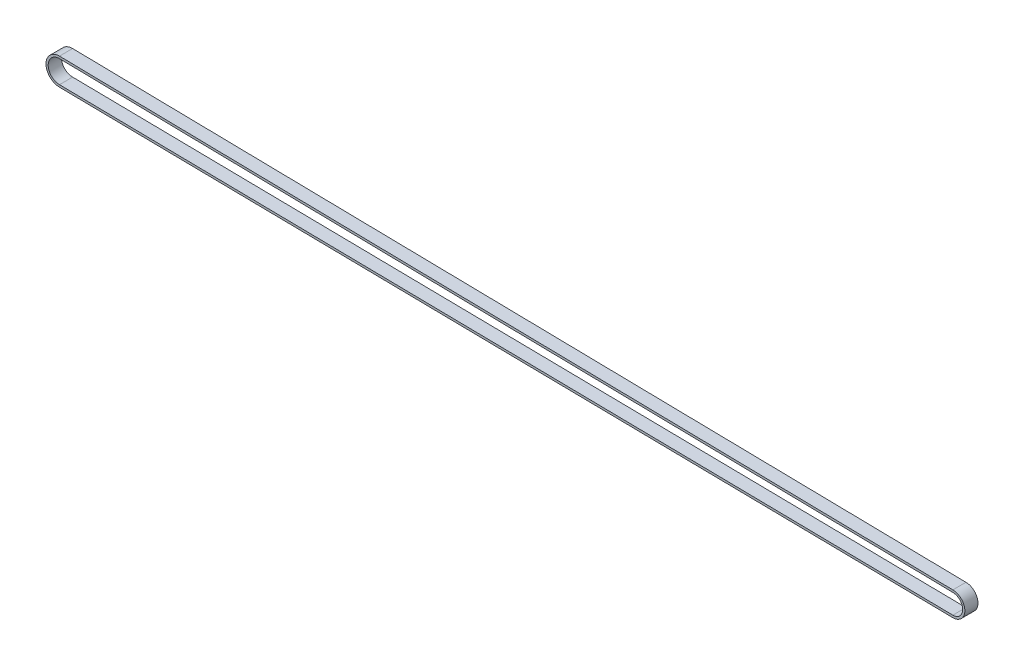
ISO-10303-21;
HEADER;
FILE_DESCRIPTION(('STEP AP214'),'2;1');
FILE_NAME('part.step','',(''),(''),'','','');
FILE_SCHEMA(('AUTOMOTIVE_DESIGN { 1 0 10303 214 1 1 1 1 }'));
ENDSEC;
DATA;
#1=APPLICATION_CONTEXT('core data for automotive mechanical design processes');
#2=APPLICATION_PROTOCOL_DEFINITION('international standard','automotive_design',2000,#1);
#3=PRODUCT_CONTEXT('',#1,'mechanical');
#4=PRODUCT('Part','Part','',(#3));
#5=PRODUCT_RELATED_PRODUCT_CATEGORY('part','',(#4));
#6=PRODUCT_DEFINITION_FORMATION('','',#4);
#7=PRODUCT_DEFINITION_CONTEXT('part definition',#1,'design');
#8=PRODUCT_DEFINITION('design','',#6,#7);
#9=PRODUCT_DEFINITION_SHAPE('','',#8);
#10=(LENGTH_UNIT() NAMED_UNIT(*) SI_UNIT(.MILLI.,.METRE.));
#11=(NAMED_UNIT(*) PLANE_ANGLE_UNIT() SI_UNIT($,.RADIAN.));
#12=(NAMED_UNIT(*) SI_UNIT($,.STERADIAN.) SOLID_ANGLE_UNIT());
#13=UNCERTAINTY_MEASURE_WITH_UNIT(LENGTH_MEASURE(1.E-05),#10,'distance_accuracy_value','');
#14=(GEOMETRIC_REPRESENTATION_CONTEXT(3) GLOBAL_UNCERTAINTY_ASSIGNED_CONTEXT((#13)) GLOBAL_UNIT_ASSIGNED_CONTEXT((#10,
#11,#12)) REPRESENTATION_CONTEXT('',''));
#15=CARTESIAN_POINT('',(0.,0.,0.));
#16=DIRECTION('',(0.,0.,1.));
#17=DIRECTION('',(1.,0.,0.));
#18=AXIS2_PLACEMENT_3D('',#15,#16,#17);
#19=CARTESIAN_POINT('',(208.218307624219,-9.12091655249381,6.));
#20=DIRECTION('',(0.0142668251289171,0.99989822367116,0.));
#21=DIRECTION('',(-0.99989822367116,0.0142668251289171,0.));
#22=AXIS2_PLACEMENT_3D('',#19,#20,#21);
#23=PLANE('',#22);
#24=DIRECTION('',(0.99989822367116,-0.0142668251289171,0.));
#25=VECTOR('',#24,1.);
#26=CARTESIAN_POINT('',(208.218307624219,-9.12091655249381,0.));
#27=LINE('',#26,#25);
#28=CARTESIAN_POINT('',(0.,-6.15000000000002,0.));
#29=VERTEX_POINT('',#28);
#30=CARTESIAN_POINT('',(407.937859821409,-11.9705705058346,0.));
#31=VERTEX_POINT('',#30);
#32=EDGE_CURVE('E141',#29,#31,#27,.T.);
#33=ORIENTED_EDGE('',*,*,#32,.T.);
#34=DIRECTION('',(0.,0.,-1.));
#35=VECTOR('',#34,1.);
#36=CARTESIAN_POINT('',(407.937859821409,-11.9705705058346,6.));
#37=LINE('',#36,#35);
#38=CARTESIAN_POINT('',(407.937859821409,-11.9705705058346,6.));
#39=VERTEX_POINT('',#38);
#40=EDGE_CURVE('E11',#39,#31,#37,.T.);
#41=ORIENTED_EDGE('',*,*,#40,.F.);
#42=DIRECTION('',(0.99989822367116,-0.0142668251289171,0.));
#43=VECTOR('',#42,1.);
#44=CARTESIAN_POINT('',(208.218307624219,-9.12091655249381,6.));
#45=LINE('',#44,#43);
#46=CARTESIAN_POINT('',(0.,-6.15000000000002,6.));
#47=VERTEX_POINT('',#46);
#48=EDGE_CURVE('E115',#47,#39,#45,.T.);
#49=ORIENTED_EDGE('',*,*,#48,.F.);
#50=DIRECTION('',(0.,0.,-1.));
#51=VECTOR('',#50,1.);
#52=CARTESIAN_POINT('',(0.,-6.15000000000002,6.));
#53=LINE('',#52,#51);
#54=EDGE_CURVE('E148',#47,#29,#53,.T.);
#55=ORIENTED_EDGE('',*,*,#54,.T.);
#56=EDGE_LOOP('',(#33,#41,#49,#55));
#57=FACE_BOUND('',#56,.T.);
#58=ADVANCED_FACE('F34',(#57),#23,.F.);
#59=CARTESIAN_POINT('',(407.937859821409,-6.47057050583456,6.));
#60=DIRECTION('',(0.,0.,-1.));
#61=DIRECTION('',(-1.,0.,0.));
#62=AXIS2_PLACEMENT_3D('',#59,#60,#61);
#63=CYLINDRICAL_SURFACE('',#62,5.5);
#64=CARTESIAN_POINT('',(407.937859821409,-6.47057050583456,0.));
#65=DIRECTION('',(0.,0.,1.));
#66=DIRECTION('',(1.,0.,0.));
#67=AXIS2_PLACEMENT_3D('',#64,#65,#66);
#68=CIRCLE('',#67,5.5);
#69=CARTESIAN_POINT('',(407.937859821409,-0.970570505834512,0.));
#70=VERTEX_POINT('',#69);
#71=EDGE_CURVE('E120',#31,#70,#68,.T.);
#72=ORIENTED_EDGE('',*,*,#71,.T.);
#73=DIRECTION('',(0.,0.,-1.));
#74=VECTOR('',#73,1.);
#75=CARTESIAN_POINT('',(407.937859821409,-0.970570505834512,6.));
#76=LINE('',#75,#74);
#77=CARTESIAN_POINT('',(407.937859821409,-0.970570505834512,6.));
#78=VERTEX_POINT('',#77);
#79=EDGE_CURVE('E44',#78,#70,#76,.T.);
#80=ORIENTED_EDGE('',*,*,#79,.F.);
#81=CARTESIAN_POINT('',(407.937859821409,-6.47057050583456,6.));
#82=DIRECTION('',(0.,0.,1.));
#83=DIRECTION('',(1.,0.,0.));
#84=AXIS2_PLACEMENT_3D('',#81,#82,#83);
#85=CIRCLE('',#84,5.5);
#86=EDGE_CURVE('E109',#39,#78,#85,.T.);
#87=ORIENTED_EDGE('',*,*,#86,.F.);
#88=ORIENTED_EDGE('',*,*,#40,.T.);
#89=EDGE_LOOP('',(#72,#80,#87,#88));
#90=FACE_BOUND('',#89,.T.);
#91=ADVANCED_FACE('F119',(#90),#63,.T.);
#92=CARTESIAN_POINT('',(209.442717453143,2.49416958207416,6.));
#93=DIRECTION('',(-0.017452378690771,-0.999847695640708,0.));
#94=DIRECTION('',(0.999847695640708,-0.017452378690771,0.));
#95=AXIS2_PLACEMENT_3D('',#92,#93,#94);
#96=PLANE('',#95);
#97=DIRECTION('',(-0.999847695640708,0.017452378690771,0.));
#98=VECTOR('',#97,1.);
#99=CARTESIAN_POINT('',(209.442717453143,2.49416958207416,0.));
#100=LINE('',#99,#98);
#101=CARTESIAN_POINT('',(0.,6.15000000000005,0.));
#102=VERTEX_POINT('',#101);
#103=EDGE_CURVE('E82',#70,#102,#100,.T.);
#104=ORIENTED_EDGE('',*,*,#103,.T.);
#105=DIRECTION('',(0.,0.,-1.));
#106=VECTOR('',#105,1.);
#107=CARTESIAN_POINT('',(0.,6.15000000000005,6.));
#108=LINE('',#107,#106);
#109=CARTESIAN_POINT('',(0.,6.15000000000005,6.));
#110=VERTEX_POINT('',#109);
#111=EDGE_CURVE('E121',#110,#102,#108,.T.);
#112=ORIENTED_EDGE('',*,*,#111,.F.);
#113=DIRECTION('',(-0.999847695640708,0.017452378690771,0.));
#114=VECTOR('',#113,1.);
#115=CARTESIAN_POINT('',(209.442717453143,2.49416958207416,6.));
#116=LINE('',#115,#114);
#117=EDGE_CURVE('E113',#78,#110,#116,.T.);
#118=ORIENTED_EDGE('',*,*,#117,.F.);
#119=ORIENTED_EDGE('',*,*,#79,.T.);
#120=EDGE_LOOP('',(#104,#112,#118,#119));
#121=FACE_BOUND('',#120,.T.);
#122=ADVANCED_FACE('F123',(#121),#96,.F.);
#123=CARTESIAN_POINT('',(407.937859821409,-6.47057050583456,6.));
#124=DIRECTION('',(0.,0.,-1.));
#125=DIRECTION('',(-1.,0.,0.));
#126=AXIS2_PLACEMENT_3D('',#123,#124,#125);
#127=CYLINDRICAL_SURFACE('',#126,4.5);
#128=CARTESIAN_POINT('',(407.937859821409,-6.47057050583456,0.));
#129=DIRECTION('',(0.,0.,1.));
#130=DIRECTION('',(1.,0.,0.));
#131=AXIS2_PLACEMENT_3D('',#128,#129,#130);
#132=CIRCLE('',#131,4.5);
#133=CARTESIAN_POINT('',(407.937859821409,-10.9705705058345,0.));
#134=VERTEX_POINT('',#133);
#135=CARTESIAN_POINT('',(407.937859821409,-1.97057050583457,0.));
#136=VERTEX_POINT('',#135);
#137=EDGE_CURVE('E129',#134,#136,#132,.T.);
#138=ORIENTED_EDGE('',*,*,#137,.F.);
#139=DIRECTION('',(0.,0.,-1.));
#140=VECTOR('',#139,1.);
#141=CARTESIAN_POINT('',(407.937859821409,-10.9705705058345,6.));
#142=LINE('',#141,#140);
#143=CARTESIAN_POINT('',(407.937859821409,-10.9705705058345,6.));
#144=VERTEX_POINT('',#143);
#145=EDGE_CURVE('E38',#144,#134,#142,.T.);
#146=ORIENTED_EDGE('',*,*,#145,.F.);
#147=CARTESIAN_POINT('',(407.937859821409,-6.47057050583456,6.));
#148=DIRECTION('',(0.,0.,1.));
#149=DIRECTION('',(1.,0.,0.));
#150=AXIS2_PLACEMENT_3D('',#147,#148,#149);
#151=CIRCLE('',#150,4.5);
#152=CARTESIAN_POINT('',(407.937859821409,-1.97057050583457,6.));
#153=VERTEX_POINT('',#152);
#154=EDGE_CURVE('E147',#144,#153,#151,.T.);
#155=ORIENTED_EDGE('',*,*,#154,.T.);
#156=DIRECTION('',(0.,0.,-1.));
#157=VECTOR('',#156,1.);
#158=CARTESIAN_POINT('',(407.937859821409,-1.97057050583457,6.));
#159=LINE('',#158,#157);
#160=EDGE_CURVE('E125',#153,#136,#159,.T.);
#161=ORIENTED_EDGE('',*,*,#160,.T.);
#162=EDGE_LOOP('',(#138,#146,#155,#161));
#163=FACE_BOUND('',#162,.T.);
#164=ADVANCED_FACE('F36',(#163),#127,.F.);
#165=CARTESIAN_POINT('',(208.232572997323,-8.12112009479299,6.));
#166=DIRECTION('',(-0.014266825128917,-0.99989822367116,0.));
#167=DIRECTION('',(0.99989822367116,-0.014266825128917,0.));
#168=AXIS2_PLACEMENT_3D('',#165,#166,#167);
#169=PLANE('',#168);
#170=DIRECTION('',(-0.99989822367116,0.014266825128917,0.));
#171=VECTOR('',#170,1.);
#172=CARTESIAN_POINT('',(208.232572997323,-8.12112009479299,0.));
#173=LINE('',#172,#171);
#174=CARTESIAN_POINT('',(0.,-5.14999999999994,0.));
#175=VERTEX_POINT('',#174);
#176=EDGE_CURVE('E132',#134,#175,#173,.T.);
#177=ORIENTED_EDGE('',*,*,#176,.T.);
#178=DIRECTION('',(0.,0.,-1.));
#179=VECTOR('',#178,1.);
#180=CARTESIAN_POINT('',(0.,-5.14999999999994,6.));
#181=LINE('',#180,#179);
#182=CARTESIAN_POINT('',(0.,-5.14999999999994,6.));
#183=VERTEX_POINT('',#182);
#184=EDGE_CURVE('E153',#183,#175,#181,.T.);
#185=ORIENTED_EDGE('',*,*,#184,.F.);
#186=DIRECTION('',(-0.99989822367116,0.014266825128917,0.));
#187=VECTOR('',#186,1.);
#188=CARTESIAN_POINT('',(208.232572997323,-8.12112009479299,6.));
#189=LINE('',#188,#187);
#190=EDGE_CURVE('E161',#144,#183,#189,.T.);
#191=ORIENTED_EDGE('',*,*,#190,.F.);
#192=ORIENTED_EDGE('',*,*,#145,.T.);
#193=EDGE_LOOP('',(#177,#185,#191,#192));
#194=FACE_BOUND('',#193,.T.);
#195=ADVANCED_FACE('F160',(#194),#169,.F.);
#196=CARTESIAN_POINT('',(0.,0.,6.));
#197=DIRECTION('',(0.,0.,-1.));
#198=DIRECTION('',(-1.,0.,0.));
#199=AXIS2_PLACEMENT_3D('',#196,#197,#198);
#200=CYLINDRICAL_SURFACE('',#199,5.15);
#201=CARTESIAN_POINT('',(0.,0.,0.));
#202=DIRECTION('',(0.,0.,1.));
#203=DIRECTION('',(1.,0.,0.));
#204=AXIS2_PLACEMENT_3D('',#201,#202,#203);
#205=CIRCLE('',#204,5.15);
#206=CARTESIAN_POINT('',(0.179732122359717,5.14686276912374,0.));
#207=VERTEX_POINT('',#206);
#208=EDGE_CURVE('E135',#207,#175,#205,.T.);
#209=ORIENTED_EDGE('',*,*,#208,.F.);
#210=DIRECTION('',(0.,0.,-1.));
#211=VECTOR('',#210,1.);
#212=CARTESIAN_POINT('',(0.179732122359717,5.14686276912374,6.));
#213=LINE('',#212,#211);
#214=CARTESIAN_POINT('',(0.179732122359717,5.14686276912374,6.));
#215=VERTEX_POINT('',#214);
#216=EDGE_CURVE('E152',#215,#207,#213,.T.);
#217=ORIENTED_EDGE('',*,*,#216,.F.);
#218=CARTESIAN_POINT('',(0.,0.,6.));
#219=DIRECTION('',(0.,0.,1.));
#220=DIRECTION('',(1.,0.,0.));
#221=AXIS2_PLACEMENT_3D('',#218,#219,#220);
#222=CIRCLE('',#221,5.15);
#223=EDGE_CURVE('E173',#215,#183,#222,.T.);
#224=ORIENTED_EDGE('',*,*,#223,.T.);
#225=ORIENTED_EDGE('',*,*,#184,.T.);
#226=EDGE_LOOP('',(#209,#217,#224,#225));
#227=FACE_BOUND('',#226,.T.);
#228=ADVANCED_FACE('F171',(#227),#200,.F.);
#229=CARTESIAN_POINT('',(209.425267732526,1.49447416759607,6.));
#230=DIRECTION('',(0.017452378690771,0.999847695640708,0.));
#231=DIRECTION('',(-0.999847695640708,0.017452378690771,0.));
#232=AXIS2_PLACEMENT_3D('',#229,#230,#231);
#233=PLANE('',#232);
#234=DIRECTION('',(0.999847695640708,-0.017452378690771,0.));
#235=VECTOR('',#234,1.);
#236=CARTESIAN_POINT('',(209.425267732526,1.49447416759607,0.));
#237=LINE('',#236,#235);
#238=EDGE_CURVE('E138',#207,#136,#237,.T.);
#239=ORIENTED_EDGE('',*,*,#238,.T.);
#240=ORIENTED_EDGE('',*,*,#160,.F.);
#241=DIRECTION('',(0.999847695640708,-0.017452378690771,0.));
#242=VECTOR('',#241,1.);
#243=CARTESIAN_POINT('',(209.425267732526,1.49447416759607,6.));
#244=LINE('',#243,#242);
#245=EDGE_CURVE('E174',#215,#153,#244,.T.);
#246=ORIENTED_EDGE('',*,*,#245,.F.);
#247=ORIENTED_EDGE('',*,*,#216,.T.);
#248=EDGE_LOOP('',(#239,#240,#246,#247));
#249=FACE_BOUND('',#248,.T.);
#250=ADVANCED_FACE('F170',(#249),#233,.F.);
#251=CARTESIAN_POINT('',(0.,0.,6.));
#252=DIRECTION('',(0.,0.,-1.));
#253=DIRECTION('',(-1.,0.,0.));
#254=AXIS2_PLACEMENT_3D('',#251,#252,#253);
#255=CYLINDRICAL_SURFACE('',#254,6.15);
#256=CARTESIAN_POINT('',(0.,0.,0.));
#257=DIRECTION('',(0.,0.,1.));
#258=DIRECTION('',(1.,0.,0.));
#259=AXIS2_PLACEMENT_3D('',#256,#257,#258);
#260=CIRCLE('',#259,6.15);
#261=EDGE_CURVE('E88',#102,#29,#260,.T.);
#262=ORIENTED_EDGE('',*,*,#261,.T.);
#263=ORIENTED_EDGE('',*,*,#54,.F.);
#264=CARTESIAN_POINT('',(0.,0.,6.));
#265=DIRECTION('',(0.,0.,1.));
#266=DIRECTION('',(1.,0.,0.));
#267=AXIS2_PLACEMENT_3D('',#264,#265,#266);
#268=CIRCLE('',#267,6.15);
#269=EDGE_CURVE('E53',#110,#47,#268,.T.);
#270=ORIENTED_EDGE('',*,*,#269,.F.);
#271=ORIENTED_EDGE('',*,*,#111,.T.);
#272=EDGE_LOOP('',(#262,#263,#270,#271));
#273=FACE_BOUND('',#272,.T.);
#274=ADVANCED_FACE('F181',(#273),#255,.T.);
#275=CARTESIAN_POINT('',(203.643929910704,-329.718674554959,6.));
#276=DIRECTION('',(0.,0.,1.));
#277=DIRECTION('',(1.,0.,0.));
#278=AXIS2_PLACEMENT_3D('',#275,#276,#277);
#279=PLANE('',#278);
#280=ORIENTED_EDGE('',*,*,#154,.F.);
#281=ORIENTED_EDGE('',*,*,#190,.T.);
#282=ORIENTED_EDGE('',*,*,#223,.F.);
#283=ORIENTED_EDGE('',*,*,#245,.T.);
#284=EDGE_LOOP('',(#280,#281,#282,#283));
#285=FACE_BOUND('',#284,.T.);
#286=ORIENTED_EDGE('',*,*,#48,.T.);
#287=ORIENTED_EDGE('',*,*,#86,.T.);
#288=ORIENTED_EDGE('',*,*,#117,.T.);
#289=ORIENTED_EDGE('',*,*,#269,.T.);
#290=EDGE_LOOP('',(#286,#287,#288,#289));
#291=FACE_BOUND('',#290,.T.);
#292=ADVANCED_FACE('F111',(#285,#291),#279,.T.);
#293=CARTESIAN_POINT('',(203.643929910704,-329.718674554959,0.));
#294=DIRECTION('',(0.,0.,1.));
#295=DIRECTION('',(1.,0.,0.));
#296=AXIS2_PLACEMENT_3D('',#293,#294,#295);
#297=PLANE('',#296);
#298=ORIENTED_EDGE('',*,*,#137,.T.);
#299=ORIENTED_EDGE('',*,*,#238,.F.);
#300=ORIENTED_EDGE('',*,*,#208,.T.);
#301=ORIENTED_EDGE('',*,*,#176,.F.);
#302=EDGE_LOOP('',(#298,#299,#300,#301));
#303=FACE_BOUND('',#302,.T.);
#304=ORIENTED_EDGE('',*,*,#32,.F.);
#305=ORIENTED_EDGE('',*,*,#261,.F.);
#306=ORIENTED_EDGE('',*,*,#103,.F.);
#307=ORIENTED_EDGE('',*,*,#71,.F.);
#308=EDGE_LOOP('',(#304,#305,#306,#307));
#309=FACE_BOUND('',#308,.T.);
#310=ADVANCED_FACE('F164',(#303,#309),#297,.F.);
#311=CLOSED_SHELL('',(#58,#91,#122,#164,#195,#228,#250,#274,#292,#310));
#312=MANIFOLD_SOLID_BREP('B2',#311);
#313=ADVANCED_BREP_SHAPE_REPRESENTATION('',(#18,#312),#14);
#314=SHAPE_DEFINITION_REPRESENTATION(#9,#313);
ENDSEC;
END-ISO-10303-21;
